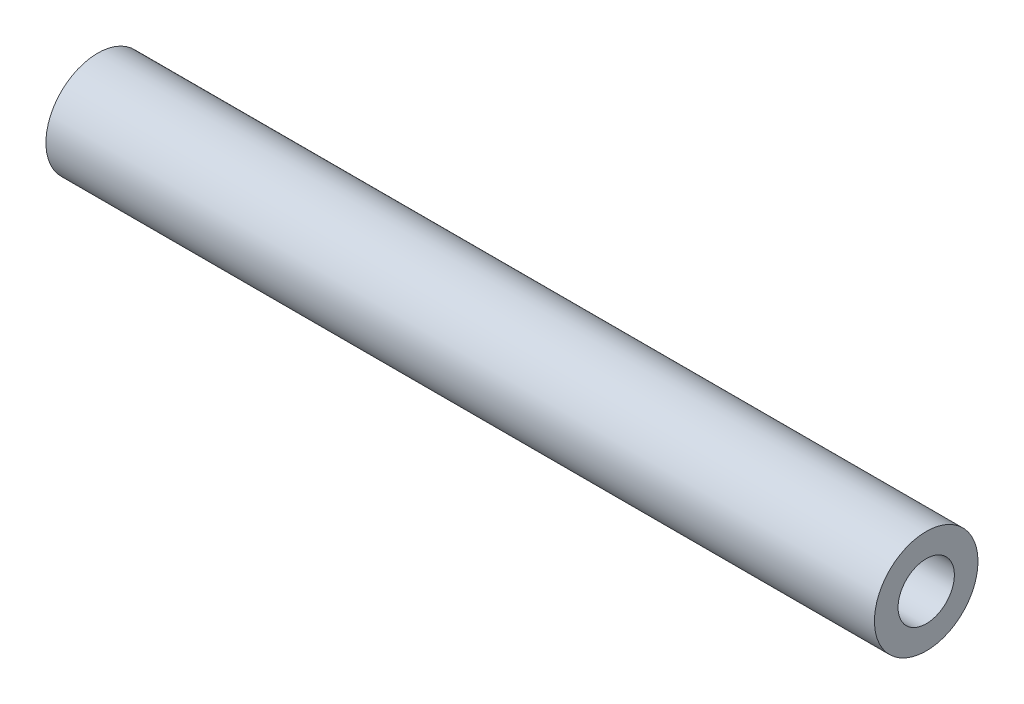
ISO-10303-21;
HEADER;
FILE_DESCRIPTION(('STEP AP214'),'2;1');
FILE_NAME('part.step','',(''),(''),'','','');
FILE_SCHEMA(('AUTOMOTIVE_DESIGN { 1 0 10303 214 1 1 1 1 }'));
ENDSEC;
DATA;
#1=APPLICATION_CONTEXT('core data for automotive mechanical design processes');
#2=APPLICATION_PROTOCOL_DEFINITION('international standard','automotive_design',2000,#1);
#3=PRODUCT_CONTEXT('',#1,'mechanical');
#4=PRODUCT('Part','Part','',(#3));
#5=PRODUCT_RELATED_PRODUCT_CATEGORY('part','',(#4));
#6=PRODUCT_DEFINITION_FORMATION('','',#4);
#7=PRODUCT_DEFINITION_CONTEXT('part definition',#1,'design');
#8=PRODUCT_DEFINITION('design','',#6,#7);
#9=PRODUCT_DEFINITION_SHAPE('','',#8);
#10=(LENGTH_UNIT() NAMED_UNIT(*) SI_UNIT(.MILLI.,.METRE.));
#11=(NAMED_UNIT(*) PLANE_ANGLE_UNIT() SI_UNIT($,.RADIAN.));
#12=(NAMED_UNIT(*) SI_UNIT($,.STERADIAN.) SOLID_ANGLE_UNIT());
#13=UNCERTAINTY_MEASURE_WITH_UNIT(LENGTH_MEASURE(1.E-05),#10,'distance_accuracy_value','');
#14=(GEOMETRIC_REPRESENTATION_CONTEXT(3) GLOBAL_UNCERTAINTY_ASSIGNED_CONTEXT((#13)) GLOBAL_UNIT_ASSIGNED_CONTEXT((#10,
#11,#12)) REPRESENTATION_CONTEXT('',''));
#15=CARTESIAN_POINT('',(0.,0.,0.));
#16=DIRECTION('',(0.,0.,1.));
#17=DIRECTION('',(1.,0.,0.));
#18=AXIS2_PLACEMENT_3D('',#15,#16,#17);
#19=CARTESIAN_POINT('',(50.8,0.,0.));
#20=DIRECTION('',(-1.,0.,0.));
#21=DIRECTION('',(0.,0.,1.));
#22=AXIS2_PLACEMENT_3D('',#19,#20,#21);
#23=CYLINDRICAL_SURFACE('',#22,3.175);
#24=CARTESIAN_POINT('',(50.8,0.,0.));
#25=DIRECTION('',(1.,0.,0.));
#26=DIRECTION('',(0.,0.,-1.));
#27=AXIS2_PLACEMENT_3D('',#24,#25,#26);
#28=CIRCLE('',#27,3.175);
#29=CARTESIAN_POINT('',(50.8,0.,-3.175));
#30=VERTEX_POINT('',#29);
#31=EDGE_CURVE('E11',#30,#30,#28,.T.);
#32=ORIENTED_EDGE('',*,*,#31,.F.);
#33=EDGE_LOOP('',(#32));
#34=FACE_BOUND('',#33,.T.);
#35=CARTESIAN_POINT('',(0.,0.,0.));
#36=DIRECTION('',(1.,0.,0.));
#37=DIRECTION('',(0.,0.,-1.));
#38=AXIS2_PLACEMENT_3D('',#35,#36,#37);
#39=CIRCLE('',#38,3.175);
#40=CARTESIAN_POINT('',(0.,0.,-3.175));
#41=VERTEX_POINT('',#40);
#42=EDGE_CURVE('E38',#41,#41,#39,.T.);
#43=ORIENTED_EDGE('',*,*,#42,.T.);
#44=EDGE_LOOP('',(#43));
#45=FACE_BOUND('',#44,.T.);
#46=ADVANCED_FACE('F35',(#34,#45),#23,.T.);
#47=CARTESIAN_POINT('',(50.8,0.,0.));
#48=DIRECTION('',(1.,0.,0.));
#49=DIRECTION('',(0.,0.,-1.));
#50=AXIS2_PLACEMENT_3D('',#47,#48,#49);
#51=PLANE('',#50);
#52=CARTESIAN_POINT('',(50.8,0.,0.));
#53=DIRECTION('',(1.,0.,0.));
#54=DIRECTION('',(0.,0.,-1.));
#55=AXIS2_PLACEMENT_3D('',#52,#53,#54);
#56=CIRCLE('',#55,1.72719999999999);
#57=CARTESIAN_POINT('',(50.8,0.,-1.72719999999999));
#58=VERTEX_POINT('',#57);
#59=EDGE_CURVE('E54',#58,#58,#56,.T.);
#60=ORIENTED_EDGE('',*,*,#59,.F.);
#61=EDGE_LOOP('',(#60));
#62=FACE_BOUND('',#61,.T.);
#63=ORIENTED_EDGE('',*,*,#31,.T.);
#64=EDGE_LOOP('',(#63));
#65=FACE_BOUND('',#64,.T.);
#66=ADVANCED_FACE('F62',(#62,#65),#51,.T.);
#67=CARTESIAN_POINT('',(0.,0.,0.));
#68=DIRECTION('',(1.,0.,0.));
#69=DIRECTION('',(0.,0.,-1.));
#70=AXIS2_PLACEMENT_3D('',#67,#68,#69);
#71=PLANE('',#70);
#72=ORIENTED_EDGE('',*,*,#42,.F.);
#73=EDGE_LOOP('',(#72));
#74=FACE_BOUND('',#73,.T.);
#75=ADVANCED_FACE('F48',(#74),#71,.F.);
#76=CARTESIAN_POINT('',(25.4,0.,0.));
#77=DIRECTION('',(1.,0.,0.));
#78=DIRECTION('',(0.,0.,-1.));
#79=AXIS2_PLACEMENT_3D('',#76,#77,#78);
#80=CONICAL_SURFACE('',#79,1.7272,1.02974425867665);
#81=CARTESIAN_POINT('',(24.3621935388156,0.,0.));
#82=VERTEX_POINT('',#81);
#83=VERTEX_LOOP('',#82);
#84=FACE_BOUND('',#83,.T.);
#85=CARTESIAN_POINT('',(25.4,0.,0.));
#86=DIRECTION('',(1.,0.,0.));
#87=DIRECTION('',(0.,0.,-1.));
#88=AXIS2_PLACEMENT_3D('',#85,#86,#87);
#89=CIRCLE('',#88,1.7272);
#90=CARTESIAN_POINT('',(25.4,0.,-1.7272));
#91=VERTEX_POINT('',#90);
#92=EDGE_CURVE('E52',#91,#91,#89,.T.);
#93=ORIENTED_EDGE('',*,*,#92,.T.);
#94=EDGE_LOOP('',(#93));
#95=FACE_BOUND('',#94,.T.);
#96=ADVANCED_FACE('F44',(#84,#95),#80,.F.);
#97=CARTESIAN_POINT('',(50.8,0.,0.));
#98=DIRECTION('',(1.,0.,0.));
#99=DIRECTION('',(0.,0.,-1.));
#100=AXIS2_PLACEMENT_3D('',#97,#98,#99);
#101=CYLINDRICAL_SURFACE('',#100,1.72719999999999);
#102=ORIENTED_EDGE('',*,*,#92,.F.);
#103=EDGE_LOOP('',(#102));
#104=FACE_BOUND('',#103,.T.);
#105=ORIENTED_EDGE('',*,*,#59,.T.);
#106=EDGE_LOOP('',(#105));
#107=FACE_BOUND('',#106,.T.);
#108=ADVANCED_FACE('F47',(#104,#107),#101,.F.);
#109=CLOSED_SHELL('',(#46,#66,#75,#96,#108));
#110=MANIFOLD_SOLID_BREP('B2',#109);
#111=ADVANCED_BREP_SHAPE_REPRESENTATION('',(#18,#110),#14);
#112=SHAPE_DEFINITION_REPRESENTATION(#9,#111);
ENDSEC;
END-ISO-10303-21;
